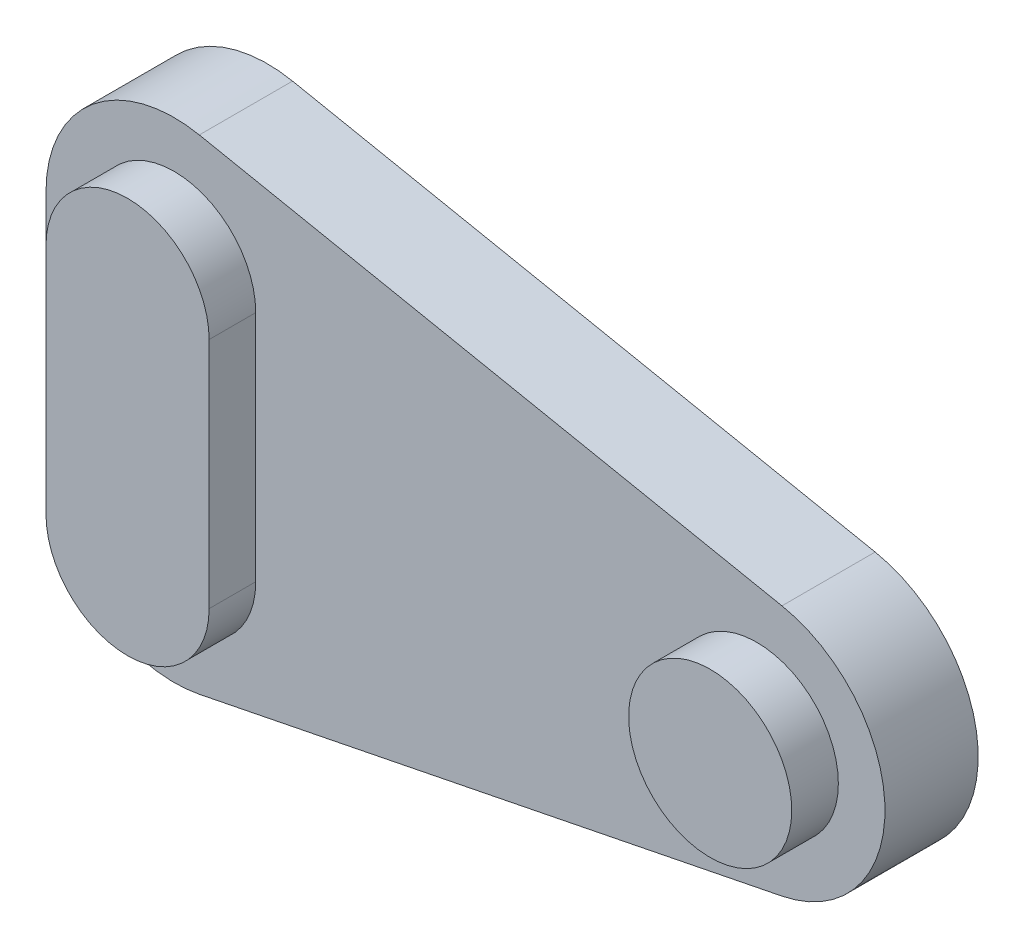
ISO-10303-21;
HEADER;
FILE_DESCRIPTION(('STEP AP214'),'2;1');
FILE_NAME('part.step','',(''),(''),'','','');
FILE_SCHEMA(('AUTOMOTIVE_DESIGN { 1 0 10303 214 1 1 1 1 }'));
ENDSEC;
DATA;
#1=APPLICATION_CONTEXT('core data for automotive mechanical design processes');
#2=APPLICATION_PROTOCOL_DEFINITION('international standard','automotive_design',2000,#1);
#3=PRODUCT_CONTEXT('',#1,'mechanical');
#4=PRODUCT('Part','Part','',(#3));
#5=PRODUCT_RELATED_PRODUCT_CATEGORY('part','',(#4));
#6=PRODUCT_DEFINITION_FORMATION('','',#4);
#7=PRODUCT_DEFINITION_CONTEXT('part definition',#1,'design');
#8=PRODUCT_DEFINITION('design','',#6,#7);
#9=PRODUCT_DEFINITION_SHAPE('','',#8);
#10=(LENGTH_UNIT() NAMED_UNIT(*) SI_UNIT(.MILLI.,.METRE.));
#11=(NAMED_UNIT(*) PLANE_ANGLE_UNIT() SI_UNIT($,.RADIAN.));
#12=(NAMED_UNIT(*) SI_UNIT($,.STERADIAN.) SOLID_ANGLE_UNIT());
#13=UNCERTAINTY_MEASURE_WITH_UNIT(LENGTH_MEASURE(1.E-05),#10,'distance_accuracy_value','');
#14=(GEOMETRIC_REPRESENTATION_CONTEXT(3) GLOBAL_UNCERTAINTY_ASSIGNED_CONTEXT((#13)) GLOBAL_UNIT_ASSIGNED_CONTEXT((#10,
#11,#12)) REPRESENTATION_CONTEXT('',''));
#15=CARTESIAN_POINT('',(0.,0.,0.));
#16=DIRECTION('',(0.,0.,1.));
#17=DIRECTION('',(1.,0.,0.));
#18=AXIS2_PLACEMENT_3D('',#15,#16,#17);
#19=CARTESIAN_POINT('',(6.985,0.,5.08));
#20=DIRECTION('',(0.,0.,-1.));
#21=DIRECTION('',(-1.,0.,0.));
#22=AXIS2_PLACEMENT_3D('',#19,#20,#21);
#23=PLANE('',#22);
#24=DIRECTION('',(0.,-1.,0.));
#25=VECTOR('',#24,1.);
#26=CARTESIAN_POINT('',(2.53999999999999,12.7,5.08));
#27=LINE('',#26,#25);
#28=CARTESIAN_POINT('',(2.53999999999999,12.7,5.08));
#29=VERTEX_POINT('',#28);
#30=CARTESIAN_POINT('',(2.54,0.,5.08));
#31=VERTEX_POINT('',#30);
#32=EDGE_CURVE('E158',#29,#31,#27,.T.);
#33=ORIENTED_EDGE('',*,*,#32,.F.);
#34=CARTESIAN_POINT('',(6.985,12.7,5.08));
#35=DIRECTION('',(0.,0.,-1.));
#36=DIRECTION('',(-1.,0.,0.));
#37=AXIS2_PLACEMENT_3D('',#34,#35,#36);
#38=CIRCLE('',#37,4.445);
#39=CARTESIAN_POINT('',(11.43,12.7,5.08));
#40=VERTEX_POINT('',#39);
#41=EDGE_CURVE('E92',#29,#40,#38,.T.);
#42=ORIENTED_EDGE('',*,*,#41,.T.);
#43=DIRECTION('',(0.,-1.,0.));
#44=VECTOR('',#43,1.);
#45=CARTESIAN_POINT('',(11.43,12.7,5.08));
#46=LINE('',#45,#44);
#47=CARTESIAN_POINT('',(11.43,0.,5.08));
#48=VERTEX_POINT('',#47);
#49=EDGE_CURVE('E99',#40,#48,#46,.T.);
#50=ORIENTED_EDGE('',*,*,#49,.T.);
#51=CARTESIAN_POINT('',(6.985,0.,5.08));
#52=DIRECTION('',(0.,0.,1.));
#53=DIRECTION('',(1.,0.,0.));
#54=AXIS2_PLACEMENT_3D('',#51,#52,#53);
#55=CIRCLE('',#54,4.445);
#56=EDGE_CURVE('E152',#31,#48,#55,.T.);
#57=ORIENTED_EDGE('',*,*,#56,.F.);
#58=EDGE_LOOP('',(#33,#42,#50,#57));
#59=FACE_BOUND('',#58,.T.);
#60=CARTESIAN_POINT('',(6.985,0.,5.08));
#61=DIRECTION('',(0.,0.,1.));
#62=DIRECTION('',(-1.,0.,0.));
#63=AXIS2_PLACEMENT_3D('',#60,#61,#62);
#64=CIRCLE('',#63,6.985);
#65=CARTESIAN_POINT('',(0.,0.,5.08));
#66=VERTEX_POINT('',#65);
#67=CARTESIAN_POINT('',(8.35487120394028,-6.84935601970106,5.08));
#68=VERTEX_POINT('',#67);
#69=EDGE_CURVE('E191',#66,#68,#64,.T.);
#70=ORIENTED_EDGE('',*,*,#69,.T.);
#71=DIRECTION('',(0.980580675690918,0.196116135138194,0.));
#72=VECTOR('',#71,1.);
#73=CARTESIAN_POINT('',(40.1048712039402,-0.49935601970074,5.08));
#74=LINE('',#73,#72);
#75=CARTESIAN_POINT('',(40.1048712039402,-0.499356019700738,5.08));
#76=VERTEX_POINT('',#75);
#77=EDGE_CURVE('E193',#68,#76,#74,.T.);
#78=ORIENTED_EDGE('',*,*,#77,.T.);
#79=CARTESIAN_POINT('',(38.735,6.35,5.08));
#80=DIRECTION('',(0.,0.,1.));
#81=DIRECTION('',(-1.,0.,0.));
#82=AXIS2_PLACEMENT_3D('',#79,#80,#81);
#83=CIRCLE('',#82,6.98499999999967);
#84=CARTESIAN_POINT('',(40.1048712039402,13.1993560197007,5.08));
#85=VERTEX_POINT('',#84);
#86=EDGE_CURVE('E197',#76,#85,#83,.T.);
#87=ORIENTED_EDGE('',*,*,#86,.T.);
#88=DIRECTION('',(-0.980580675690918,0.196116135138194,0.));
#89=VECTOR('',#88,1.);
#90=CARTESIAN_POINT('',(8.35487120394028,19.5493560197011,5.08));
#91=LINE('',#90,#89);
#92=CARTESIAN_POINT('',(8.35487120394028,19.5493560197011,5.08));
#93=VERTEX_POINT('',#92);
#94=EDGE_CURVE('E200',#85,#93,#91,.T.);
#95=ORIENTED_EDGE('',*,*,#94,.T.);
#96=CARTESIAN_POINT('',(6.985,12.7,5.08));
#97=DIRECTION('',(0.,0.,1.));
#98=DIRECTION('',(1.,0.,0.));
#99=AXIS2_PLACEMENT_3D('',#96,#97,#98);
#100=CIRCLE('',#99,6.985);
#101=CARTESIAN_POINT('',(0.,12.7,5.08));
#102=VERTEX_POINT('',#101);
#103=EDGE_CURVE('E203',#93,#102,#100,.T.);
#104=ORIENTED_EDGE('',*,*,#103,.T.);
#105=DIRECTION('',(0.,-1.,0.));
#106=VECTOR('',#105,1.);
#107=CARTESIAN_POINT('',(0.,0.,5.08));
#108=LINE('',#107,#106);
#109=EDGE_CURVE('E201',#102,#66,#108,.T.);
#110=ORIENTED_EDGE('',*,*,#109,.T.);
#111=EDGE_LOOP('',(#70,#78,#87,#95,#104,#110));
#112=FACE_BOUND('',#111,.T.);
#113=CARTESIAN_POINT('',(38.735,6.35,5.08));
#114=DIRECTION('',(0.,0.,1.));
#115=DIRECTION('',(1.,0.,0.));
#116=AXIS2_PLACEMENT_3D('',#113,#114,#115);
#117=CIRCLE('',#116,4.445);
#118=CARTESIAN_POINT('',(43.18,6.35,5.08));
#119=VERTEX_POINT('',#118);
#120=EDGE_CURVE('E12',#119,#119,#117,.T.);
#121=ORIENTED_EDGE('',*,*,#120,.F.);
#122=EDGE_LOOP('',(#121));
#123=FACE_BOUND('',#122,.T.);
#124=ADVANCED_FACE('F80',(#59,#112,#123),#23,.F.);
#125=CARTESIAN_POINT('',(6.985,0.,5.08));
#126=DIRECTION('',(0.,0.,-1.));
#127=DIRECTION('',(-1.,0.,0.));
#128=AXIS2_PLACEMENT_3D('',#125,#126,#127);
#129=CYLINDRICAL_SURFACE('',#128,6.985);
#130=CARTESIAN_POINT('',(6.985,0.,0.));
#131=DIRECTION('',(0.,0.,1.));
#132=DIRECTION('',(-1.,0.,0.));
#133=AXIS2_PLACEMENT_3D('',#130,#131,#132);
#134=CIRCLE('',#133,6.985);
#135=CARTESIAN_POINT('',(0.,0.,0.));
#136=VERTEX_POINT('',#135);
#137=CARTESIAN_POINT('',(8.35487120394028,-6.84935601970106,0.));
#138=VERTEX_POINT('',#137);
#139=EDGE_CURVE('E206',#136,#138,#134,.T.);
#140=ORIENTED_EDGE('',*,*,#139,.T.);
#141=DIRECTION('',(0.,0.,-1.));
#142=VECTOR('',#141,1.);
#143=CARTESIAN_POINT('',(8.35487120394028,-6.84935601970106,5.08));
#144=LINE('',#143,#142);
#145=EDGE_CURVE('E82',#68,#138,#144,.T.);
#146=ORIENTED_EDGE('',*,*,#145,.F.);
#147=ORIENTED_EDGE('',*,*,#69,.F.);
#148=DIRECTION('',(0.,0.,-1.));
#149=VECTOR('',#148,1.);
#150=CARTESIAN_POINT('',(0.,0.,5.08));
#151=LINE('',#150,#149);
#152=EDGE_CURVE('E202',#66,#136,#151,.T.);
#153=ORIENTED_EDGE('',*,*,#152,.T.);
#154=EDGE_LOOP('',(#140,#146,#147,#153));
#155=FACE_BOUND('',#154,.T.);
#156=ADVANCED_FACE('F81',(#155),#129,.T.);
#157=CARTESIAN_POINT('',(40.1048712039402,-0.49935601970074,5.08));
#158=DIRECTION('',(-0.196116135138194,0.980580675690918,0.));
#159=DIRECTION('',(-0.980580675690918,-0.196116135138194,0.));
#160=AXIS2_PLACEMENT_3D('',#157,#158,#159);
#161=PLANE('',#160);
#162=DIRECTION('',(0.980580675690918,0.196116135138194,0.));
#163=VECTOR('',#162,1.);
#164=CARTESIAN_POINT('',(40.1048712039402,-0.49935601970074,0.));
#165=LINE('',#164,#163);
#166=CARTESIAN_POINT('',(40.1048712039402,-0.499356019700738,0.));
#167=VERTEX_POINT('',#166);
#168=EDGE_CURVE('E207',#138,#167,#165,.T.);
#169=ORIENTED_EDGE('',*,*,#168,.T.);
#170=DIRECTION('',(0.,0.,-1.));
#171=VECTOR('',#170,1.);
#172=CARTESIAN_POINT('',(40.1048712039402,-0.499356019700738,5.08));
#173=LINE('',#172,#171);
#174=EDGE_CURVE('E227',#76,#167,#173,.T.);
#175=ORIENTED_EDGE('',*,*,#174,.F.);
#176=ORIENTED_EDGE('',*,*,#77,.F.);
#177=ORIENTED_EDGE('',*,*,#145,.T.);
#178=EDGE_LOOP('',(#169,#175,#176,#177));
#179=FACE_BOUND('',#178,.T.);
#180=ADVANCED_FACE('F240',(#179),#161,.F.);
#181=CARTESIAN_POINT('',(38.735,6.35,5.08));
#182=DIRECTION('',(0.,0.,-1.));
#183=DIRECTION('',(-1.,0.,0.));
#184=AXIS2_PLACEMENT_3D('',#181,#182,#183);
#185=CYLINDRICAL_SURFACE('',#184,6.98499999999967);
#186=CARTESIAN_POINT('',(38.735,6.35,0.));
#187=DIRECTION('',(0.,0.,1.));
#188=DIRECTION('',(-1.,0.,0.));
#189=AXIS2_PLACEMENT_3D('',#186,#187,#188);
#190=CIRCLE('',#189,6.98499999999967);
#191=CARTESIAN_POINT('',(40.1048712039402,13.1993560197007,0.));
#192=VERTEX_POINT('',#191);
#193=EDGE_CURVE('E211',#167,#192,#190,.T.);
#194=ORIENTED_EDGE('',*,*,#193,.T.);
#195=DIRECTION('',(0.,0.,-1.));
#196=VECTOR('',#195,1.);
#197=CARTESIAN_POINT('',(40.1048712039402,13.1993560197007,5.08));
#198=LINE('',#197,#196);
#199=EDGE_CURVE('E228',#85,#192,#198,.T.);
#200=ORIENTED_EDGE('',*,*,#199,.F.);
#201=ORIENTED_EDGE('',*,*,#86,.F.);
#202=ORIENTED_EDGE('',*,*,#174,.T.);
#203=EDGE_LOOP('',(#194,#200,#201,#202));
#204=FACE_BOUND('',#203,.T.);
#205=ADVANCED_FACE('F247',(#204),#185,.T.);
#206=CARTESIAN_POINT('',(8.35487120394028,19.5493560197011,5.08));
#207=DIRECTION('',(-0.196116135138194,-0.980580675690918,0.));
#208=DIRECTION('',(0.980580675690918,-0.196116135138194,0.));
#209=AXIS2_PLACEMENT_3D('',#206,#207,#208);
#210=PLANE('',#209);
#211=DIRECTION('',(-0.980580675690918,0.196116135138194,0.));
#212=VECTOR('',#211,1.);
#213=CARTESIAN_POINT('',(8.35487120394028,19.5493560197011,0.));
#214=LINE('',#213,#212);
#215=CARTESIAN_POINT('',(8.35487120394028,19.5493560197011,0.));
#216=VERTEX_POINT('',#215);
#217=EDGE_CURVE('E213',#192,#216,#214,.T.);
#218=ORIENTED_EDGE('',*,*,#217,.T.);
#219=DIRECTION('',(0.,0.,-1.));
#220=VECTOR('',#219,1.);
#221=CARTESIAN_POINT('',(8.35487120394028,19.5493560197011,5.08));
#222=LINE('',#221,#220);
#223=EDGE_CURVE('E224',#93,#216,#222,.T.);
#224=ORIENTED_EDGE('',*,*,#223,.F.);
#225=ORIENTED_EDGE('',*,*,#94,.F.);
#226=ORIENTED_EDGE('',*,*,#199,.T.);
#227=EDGE_LOOP('',(#218,#224,#225,#226));
#228=FACE_BOUND('',#227,.T.);
#229=ADVANCED_FACE('F253',(#228),#210,.F.);
#230=CARTESIAN_POINT('',(6.985,12.7,5.08));
#231=DIRECTION('',(0.,0.,-1.));
#232=DIRECTION('',(-1.,0.,0.));
#233=AXIS2_PLACEMENT_3D('',#230,#231,#232);
#234=CYLINDRICAL_SURFACE('',#233,6.985);
#235=CARTESIAN_POINT('',(6.985,12.7,0.));
#236=DIRECTION('',(0.,0.,1.));
#237=DIRECTION('',(1.,0.,0.));
#238=AXIS2_PLACEMENT_3D('',#235,#236,#237);
#239=CIRCLE('',#238,6.985);
#240=CARTESIAN_POINT('',(0.,12.7,0.));
#241=VERTEX_POINT('',#240);
#242=EDGE_CURVE('E214',#216,#241,#239,.T.);
#243=ORIENTED_EDGE('',*,*,#242,.T.);
#244=DIRECTION('',(0.,0.,-1.));
#245=VECTOR('',#244,1.);
#246=CARTESIAN_POINT('',(0.,12.7,5.08));
#247=LINE('',#246,#245);
#248=EDGE_CURVE('E219',#102,#241,#247,.T.);
#249=ORIENTED_EDGE('',*,*,#248,.F.);
#250=ORIENTED_EDGE('',*,*,#103,.F.);
#251=ORIENTED_EDGE('',*,*,#223,.T.);
#252=EDGE_LOOP('',(#243,#249,#250,#251));
#253=FACE_BOUND('',#252,.T.);
#254=ADVANCED_FACE('F257',(#253),#234,.T.);
#255=CARTESIAN_POINT('',(0.,0.,5.08));
#256=DIRECTION('',(1.,0.,0.));
#257=DIRECTION('',(0.,0.,-1.));
#258=AXIS2_PLACEMENT_3D('',#255,#256,#257);
#259=PLANE('',#258);
#260=DIRECTION('',(0.,-1.,0.));
#261=VECTOR('',#260,1.);
#262=CARTESIAN_POINT('',(0.,0.,0.));
#263=LINE('',#262,#261);
#264=EDGE_CURVE('E194',#241,#136,#263,.T.);
#265=ORIENTED_EDGE('',*,*,#264,.T.);
#266=ORIENTED_EDGE('',*,*,#152,.F.);
#267=ORIENTED_EDGE('',*,*,#109,.F.);
#268=ORIENTED_EDGE('',*,*,#248,.T.);
#269=EDGE_LOOP('',(#265,#266,#267,#268));
#270=FACE_BOUND('',#269,.T.);
#271=ADVANCED_FACE('F256',(#270),#259,.F.);
#272=CARTESIAN_POINT('',(6.985,0.,0.));
#273=DIRECTION('',(0.,0.,-1.));
#274=DIRECTION('',(-1.,0.,0.));
#275=AXIS2_PLACEMENT_3D('',#272,#273,#274);
#276=PLANE('',#275);
#277=ORIENTED_EDGE('',*,*,#139,.F.);
#278=ORIENTED_EDGE('',*,*,#264,.F.);
#279=ORIENTED_EDGE('',*,*,#242,.F.);
#280=ORIENTED_EDGE('',*,*,#217,.F.);
#281=ORIENTED_EDGE('',*,*,#193,.F.);
#282=ORIENTED_EDGE('',*,*,#168,.F.);
#283=EDGE_LOOP('',(#277,#278,#279,#280,#281,#282));
#284=FACE_BOUND('',#283,.T.);
#285=ADVANCED_FACE('F245',(#284),#276,.T.);
#286=CARTESIAN_POINT('',(6.985,12.7,7.62));
#287=DIRECTION('',(0.,0.,-1.));
#288=DIRECTION('',(-1.,0.,0.));
#289=AXIS2_PLACEMENT_3D('',#286,#287,#288);
#290=CYLINDRICAL_SURFACE('',#289,4.445);
#291=ORIENTED_EDGE('',*,*,#41,.F.);
#292=DIRECTION('',(0.,0.,-1.));
#293=VECTOR('',#292,1.);
#294=CARTESIAN_POINT('',(2.53999999999999,12.7,7.62));
#295=LINE('',#294,#293);
#296=CARTESIAN_POINT('',(2.53999999999999,12.7,7.62));
#297=VERTEX_POINT('',#296);
#298=EDGE_CURVE('E171',#297,#29,#295,.T.);
#299=ORIENTED_EDGE('',*,*,#298,.F.);
#300=CARTESIAN_POINT('',(6.985,12.7,7.62));
#301=DIRECTION('',(0.,0.,-1.));
#302=DIRECTION('',(-1.,0.,0.));
#303=AXIS2_PLACEMENT_3D('',#300,#301,#302);
#304=CIRCLE('',#303,4.445);
#305=CARTESIAN_POINT('',(11.43,12.7,7.62));
#306=VERTEX_POINT('',#305);
#307=EDGE_CURVE('E188',#297,#306,#304,.T.);
#308=ORIENTED_EDGE('',*,*,#307,.T.);
#309=DIRECTION('',(0.,0.,-1.));
#310=VECTOR('',#309,1.);
#311=CARTESIAN_POINT('',(11.43,12.7,7.62));
#312=LINE('',#311,#310);
#313=EDGE_CURVE('E184',#306,#40,#312,.T.);
#314=ORIENTED_EDGE('',*,*,#313,.T.);
#315=EDGE_LOOP('',(#291,#299,#308,#314));
#316=FACE_BOUND('',#315,.T.);
#317=ADVANCED_FACE('F278',(#316),#290,.T.);
#318=CARTESIAN_POINT('',(6.985,12.7,7.62));
#319=DIRECTION('',(0.,0.,-1.));
#320=DIRECTION('',(-1.,0.,0.));
#321=AXIS2_PLACEMENT_3D('',#318,#319,#320);
#322=PLANE('',#321);
#323=ORIENTED_EDGE('',*,*,#307,.F.);
#324=DIRECTION('',(0.,-1.,0.));
#325=VECTOR('',#324,1.);
#326=CARTESIAN_POINT('',(2.53999999999999,12.7,7.62));
#327=LINE('',#326,#325);
#328=CARTESIAN_POINT('',(2.54,0.,7.62));
#329=VERTEX_POINT('',#328);
#330=EDGE_CURVE('E173',#297,#329,#327,.T.);
#331=ORIENTED_EDGE('',*,*,#330,.T.);
#332=CARTESIAN_POINT('',(6.985,0.,7.62));
#333=DIRECTION('',(0.,0.,1.));
#334=DIRECTION('',(1.,0.,0.));
#335=AXIS2_PLACEMENT_3D('',#332,#333,#334);
#336=CIRCLE('',#335,4.445);
#337=CARTESIAN_POINT('',(11.43,0.,7.62));
#338=VERTEX_POINT('',#337);
#339=EDGE_CURVE('E165',#329,#338,#336,.T.);
#340=ORIENTED_EDGE('',*,*,#339,.T.);
#341=DIRECTION('',(0.,-1.,0.));
#342=VECTOR('',#341,1.);
#343=CARTESIAN_POINT('',(11.43,12.7,7.62));
#344=LINE('',#343,#342);
#345=EDGE_CURVE('E176',#306,#338,#344,.T.);
#346=ORIENTED_EDGE('',*,*,#345,.F.);
#347=EDGE_LOOP('',(#323,#331,#340,#346));
#348=FACE_BOUND('',#347,.T.);
#349=ADVANCED_FACE('F279',(#348),#322,.F.);
#350=CARTESIAN_POINT('',(6.985,0.,7.62));
#351=DIRECTION('',(0.,0.,-1.));
#352=DIRECTION('',(-1.,0.,0.));
#353=AXIS2_PLACEMENT_3D('',#350,#351,#352);
#354=CYLINDRICAL_SURFACE('',#353,4.445);
#355=ORIENTED_EDGE('',*,*,#56,.T.);
#356=DIRECTION('',(0.,0.,-1.));
#357=VECTOR('',#356,1.);
#358=CARTESIAN_POINT('',(11.43,0.,7.62));
#359=LINE('',#358,#357);
#360=EDGE_CURVE('E174',#338,#48,#359,.T.);
#361=ORIENTED_EDGE('',*,*,#360,.F.);
#362=ORIENTED_EDGE('',*,*,#339,.F.);
#363=DIRECTION('',(0.,0.,-1.));
#364=VECTOR('',#363,1.);
#365=CARTESIAN_POINT('',(2.54,0.,7.62));
#366=LINE('',#365,#364);
#367=EDGE_CURVE('E164',#329,#31,#366,.T.);
#368=ORIENTED_EDGE('',*,*,#367,.T.);
#369=EDGE_LOOP('',(#355,#361,#362,#368));
#370=FACE_BOUND('',#369,.T.);
#371=ADVANCED_FACE('F167',(#370),#354,.T.);
#372=CARTESIAN_POINT('',(11.43,12.7,7.62));
#373=DIRECTION('',(1.,0.,0.));
#374=DIRECTION('',(0.,1.,0.));
#375=AXIS2_PLACEMENT_3D('',#372,#373,#374);
#376=PLANE('',#375);
#377=ORIENTED_EDGE('',*,*,#49,.F.);
#378=ORIENTED_EDGE('',*,*,#313,.F.);
#379=ORIENTED_EDGE('',*,*,#345,.T.);
#380=ORIENTED_EDGE('',*,*,#360,.T.);
#381=EDGE_LOOP('',(#377,#378,#379,#380));
#382=FACE_BOUND('',#381,.T.);
#383=ADVANCED_FACE('F295',(#382),#376,.T.);
#384=CARTESIAN_POINT('',(2.53999999999999,12.7,7.62));
#385=DIRECTION('',(1.,0.,0.));
#386=DIRECTION('',(0.,1.,0.));
#387=AXIS2_PLACEMENT_3D('',#384,#385,#386);
#388=PLANE('',#387);
#389=ORIENTED_EDGE('',*,*,#32,.T.);
#390=ORIENTED_EDGE('',*,*,#367,.F.);
#391=ORIENTED_EDGE('',*,*,#330,.F.);
#392=ORIENTED_EDGE('',*,*,#298,.T.);
#393=EDGE_LOOP('',(#389,#390,#391,#392));
#394=FACE_BOUND('',#393,.T.);
#395=ADVANCED_FACE('F175',(#394),#388,.F.);
#396=CARTESIAN_POINT('',(38.735,6.35,7.62));
#397=DIRECTION('',(0.,0.,-1.));
#398=DIRECTION('',(-1.,0.,0.));
#399=AXIS2_PLACEMENT_3D('',#396,#397,#398);
#400=CYLINDRICAL_SURFACE('',#399,4.445);
#401=CARTESIAN_POINT('',(38.735,6.35,7.62));
#402=DIRECTION('',(0.,0.,1.));
#403=DIRECTION('',(1.,0.,0.));
#404=AXIS2_PLACEMENT_3D('',#401,#402,#403);
#405=CIRCLE('',#404,4.445);
#406=CARTESIAN_POINT('',(43.18,6.35,7.62));
#407=VERTEX_POINT('',#406);
#408=EDGE_CURVE('E161',#407,#407,#405,.T.);
#409=ORIENTED_EDGE('',*,*,#408,.F.);
#410=EDGE_LOOP('',(#409));
#411=FACE_BOUND('',#410,.T.);
#412=ORIENTED_EDGE('',*,*,#120,.T.);
#413=EDGE_LOOP('',(#412));
#414=FACE_BOUND('',#413,.T.);
#415=ADVANCED_FACE('F292',(#411,#414),#400,.T.);
#416=CARTESIAN_POINT('',(38.735,6.35,7.62));
#417=DIRECTION('',(0.,0.,1.));
#418=DIRECTION('',(1.,0.,0.));
#419=AXIS2_PLACEMENT_3D('',#416,#417,#418);
#420=PLANE('',#419);
#421=ORIENTED_EDGE('',*,*,#408,.T.);
#422=EDGE_LOOP('',(#421));
#423=FACE_BOUND('',#422,.T.);
#424=ADVANCED_FACE('F296',(#423),#420,.T.);
#425=CLOSED_SHELL('',(#124,#156,#180,#205,#229,#254,#271,#285,#317,#349,#371,#383,#395,#415,#424));
#426=MANIFOLD_SOLID_BREP('B2',#425);
#427=ADVANCED_BREP_SHAPE_REPRESENTATION('',(#18,#426),#14);
#428=SHAPE_DEFINITION_REPRESENTATION(#9,#427);
ENDSEC;
END-ISO-10303-21;
